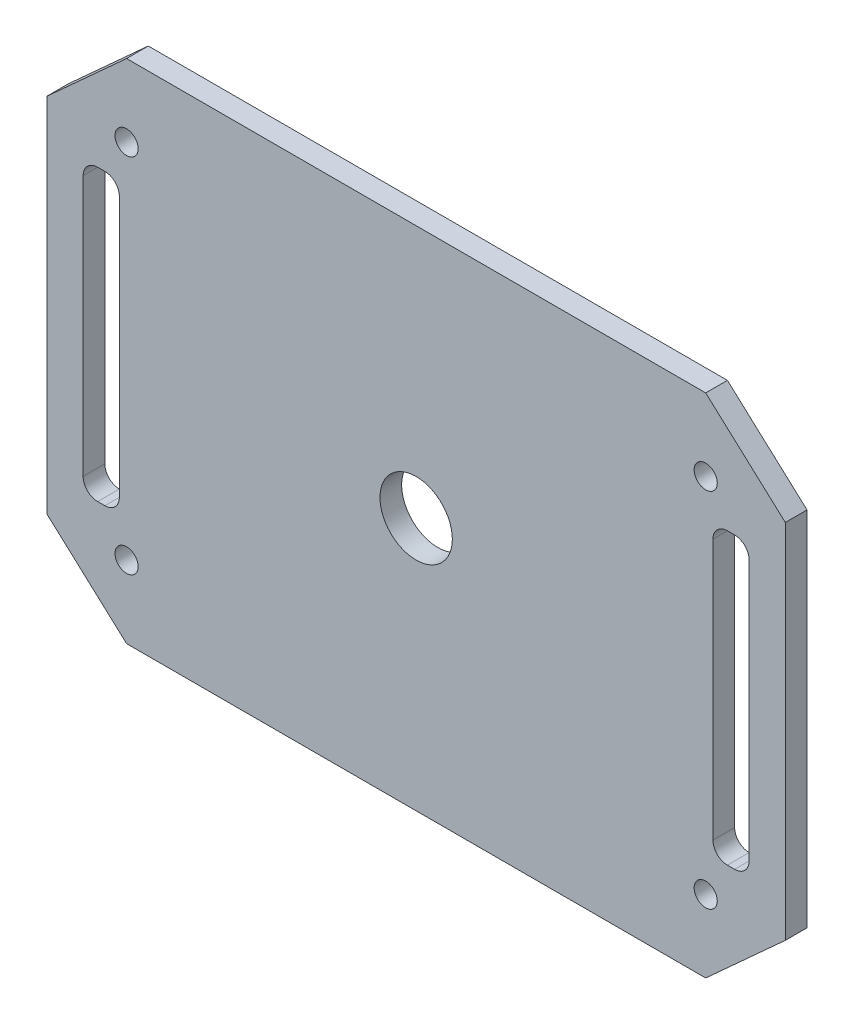
ISO-10303-21;
HEADER;
FILE_DESCRIPTION(('STEP AP214'),'2;1');
FILE_NAME('part.step','',(''),(''),'','','');
FILE_SCHEMA(('AUTOMOTIVE_DESIGN { 1 0 10303 214 1 1 1 1 }'));
ENDSEC;
DATA;
#1=APPLICATION_CONTEXT('core data for automotive mechanical design processes');
#2=APPLICATION_PROTOCOL_DEFINITION('international standard','automotive_design',2000,#1);
#3=PRODUCT_CONTEXT('',#1,'mechanical');
#4=PRODUCT('Part','Part','',(#3));
#5=PRODUCT_RELATED_PRODUCT_CATEGORY('part','',(#4));
#6=PRODUCT_DEFINITION_FORMATION('','',#4);
#7=PRODUCT_DEFINITION_CONTEXT('part definition',#1,'design');
#8=PRODUCT_DEFINITION('design','',#6,#7);
#9=PRODUCT_DEFINITION_SHAPE('','',#8);
#10=(LENGTH_UNIT() NAMED_UNIT(*) SI_UNIT(.MILLI.,.METRE.));
#11=(NAMED_UNIT(*) PLANE_ANGLE_UNIT() SI_UNIT($,.RADIAN.));
#12=(NAMED_UNIT(*) SI_UNIT($,.STERADIAN.) SOLID_ANGLE_UNIT());
#13=UNCERTAINTY_MEASURE_WITH_UNIT(LENGTH_MEASURE(1.E-05),#10,'distance_accuracy_value','');
#14=(GEOMETRIC_REPRESENTATION_CONTEXT(3) GLOBAL_UNCERTAINTY_ASSIGNED_CONTEXT((#13)) GLOBAL_UNIT_ASSIGNED_CONTEXT((#10,
#11,#12)) REPRESENTATION_CONTEXT('',''));
#15=CARTESIAN_POINT('',(0.,0.,0.));
#16=DIRECTION('',(0.,0.,1.));
#17=DIRECTION('',(1.,0.,0.));
#18=AXIS2_PLACEMENT_3D('',#15,#16,#17);
#19=CARTESIAN_POINT('',(0.,0.,3.));
#20=DIRECTION('',(0.,0.,1.));
#21=DIRECTION('',(1.,0.,0.));
#22=AXIS2_PLACEMENT_3D('',#19,#20,#21);
#23=PLANE('',#22);
#24=CARTESIAN_POINT('',(0.1460104534,-83.8449471917,3.));
#25=DIRECTION('',(0.,0.,1.));
#26=DIRECTION('',(1.,0.,0.));
#27=AXIS2_PLACEMENT_3D('',#24,#25,#26);
#28=CIRCLE('',#27,1.6);
#29=CARTESIAN_POINT('',(1.7460104534,-83.8449471917,3.));
#30=VERTEX_POINT('',#29);
#31=EDGE_CURVE('E662',#30,#30,#28,.T.);
#32=ORIENTED_EDGE('',*,*,#31,.F.);
#33=EDGE_LOOP('',(#32));
#34=FACE_BOUND('',#33,.T.);
#35=CARTESIAN_POINT('',(80.1460104534,-33.8449471917,3.));
#36=DIRECTION('',(0.,0.,1.));
#37=DIRECTION('',(1.,0.,0.));
#38=AXIS2_PLACEMENT_3D('',#35,#36,#37);
#39=CIRCLE('',#38,1.60000000000001);
#40=CARTESIAN_POINT('',(81.7460104534,-33.8449471917,3.));
#41=VERTEX_POINT('',#40);
#42=EDGE_CURVE('E674',#41,#41,#39,.T.);
#43=ORIENTED_EDGE('',*,*,#42,.F.);
#44=EDGE_LOOP('',(#43));
#45=FACE_BOUND('',#44,.T.);
#46=DIRECTION('',(0.,1.,0.));
#47=VECTOR('',#46,1.);
#48=CARTESIAN_POINT('',(-0.8539895466,-40.8449471917,3.));
#49=LINE('',#48,#47);
#50=CARTESIAN_POINT('',(-0.8539895466,-76.8449471917,3.));
#51=VERTEX_POINT('',#50);
#52=CARTESIAN_POINT('',(-0.853989546599999,-40.8449471917,3.));
#53=VERTEX_POINT('',#52);
#54=EDGE_CURVE('E202',#51,#53,#49,.T.);
#55=ORIENTED_EDGE('',*,*,#54,.F.);
#56=CARTESIAN_POINT('',(-2.8539895466,-76.8449471917,3.));
#57=DIRECTION('',(0.,0.,1.));
#58=DIRECTION('',(1.,0.,0.));
#59=AXIS2_PLACEMENT_3D('',#56,#57,#58);
#60=CIRCLE('',#59,2.);
#61=CARTESIAN_POINT('',(-2.8539895466,-78.8449471917,3.));
#62=VERTEX_POINT('',#61);
#63=EDGE_CURVE('E194',#62,#51,#60,.T.);
#64=ORIENTED_EDGE('',*,*,#63,.F.);
#65=DIRECTION('',(1.,0.,0.));
#66=VECTOR('',#65,1.);
#67=CARTESIAN_POINT('',(-3.8539895466,-78.8449471917,3.));
#68=LINE('',#67,#66);
#69=CARTESIAN_POINT('',(-3.8539895466,-78.8449471917,3.));
#70=VERTEX_POINT('',#69);
#71=EDGE_CURVE('E229',#70,#62,#68,.T.);
#72=ORIENTED_EDGE('',*,*,#71,.F.);
#73=CARTESIAN_POINT('',(-3.8539895466,-76.8449471917,3.));
#74=DIRECTION('',(0.,0.,1.));
#75=DIRECTION('',(1.,0.,0.));
#76=AXIS2_PLACEMENT_3D('',#73,#74,#75);
#77=CIRCLE('',#76,2.);
#78=CARTESIAN_POINT('',(-5.8539895466,-76.8449471917,3.));
#79=VERTEX_POINT('',#78);
#80=EDGE_CURVE('E227',#79,#70,#77,.T.);
#81=ORIENTED_EDGE('',*,*,#80,.F.);
#82=DIRECTION('',(0.,-1.,0.));
#83=VECTOR('',#82,1.);
#84=CARTESIAN_POINT('',(-5.8539895466,-40.8449471917,3.));
#85=LINE('',#84,#83);
#86=CARTESIAN_POINT('',(-5.8539895466,-40.8449471917,3.));
#87=VERTEX_POINT('',#86);
#88=EDGE_CURVE('E225',#87,#79,#85,.T.);
#89=ORIENTED_EDGE('',*,*,#88,.F.);
#90=CARTESIAN_POINT('',(-3.8539895466,-40.8449471917,3.));
#91=DIRECTION('',(0.,0.,1.));
#92=DIRECTION('',(1.,0.,0.));
#93=AXIS2_PLACEMENT_3D('',#90,#91,#92);
#94=CIRCLE('',#93,2.);
#95=CARTESIAN_POINT('',(-3.8539895466,-38.8449471917,3.));
#96=VERTEX_POINT('',#95);
#97=EDGE_CURVE('E223',#96,#87,#94,.T.);
#98=ORIENTED_EDGE('',*,*,#97,.F.);
#99=DIRECTION('',(-1.,0.,0.));
#100=VECTOR('',#99,1.);
#101=CARTESIAN_POINT('',(-3.8539895466,-38.8449471917,3.));
#102=LINE('',#101,#100);
#103=CARTESIAN_POINT('',(-2.8539895466,-38.8449471917,3.));
#104=VERTEX_POINT('',#103);
#105=EDGE_CURVE('E218',#104,#96,#102,.T.);
#106=ORIENTED_EDGE('',*,*,#105,.F.);
#107=CARTESIAN_POINT('',(-2.8539895466,-40.8449471917,3.));
#108=DIRECTION('',(0.,0.,1.));
#109=DIRECTION('',(1.,0.,0.));
#110=AXIS2_PLACEMENT_3D('',#107,#108,#109);
#111=CIRCLE('',#110,2.);
#112=EDGE_CURVE('E216',#53,#104,#111,.T.);
#113=ORIENTED_EDGE('',*,*,#112,.F.);
#114=EDGE_LOOP('',(#55,#64,#72,#81,#89,#98,#106,#113));
#115=FACE_BOUND('',#114,.T.);
#116=DIRECTION('',(-1.,0.,0.));
#117=VECTOR('',#116,1.);
#118=CARTESIAN_POINT('',(84.1460104534,-38.8449471917,3.));
#119=LINE('',#118,#117);
#120=CARTESIAN_POINT('',(84.1460104534,-38.8449471917,3.));
#121=VERTEX_POINT('',#120);
#122=CARTESIAN_POINT('',(83.1460104534,-38.8449471917,3.));
#123=VERTEX_POINT('',#122);
#124=EDGE_CURVE('E264',#121,#123,#119,.T.);
#125=ORIENTED_EDGE('',*,*,#124,.F.);
#126=CARTESIAN_POINT('',(84.1460104534,-40.8449471917,3.));
#127=DIRECTION('',(0.,0.,1.));
#128=DIRECTION('',(1.,0.,0.));
#129=AXIS2_PLACEMENT_3D('',#126,#127,#128);
#130=CIRCLE('',#129,2.);
#131=CARTESIAN_POINT('',(86.1460104534,-40.8449471917,3.));
#132=VERTEX_POINT('',#131);
#133=EDGE_CURVE('E262',#132,#121,#130,.T.);
#134=ORIENTED_EDGE('',*,*,#133,.F.);
#135=DIRECTION('',(0.,1.,0.));
#136=VECTOR('',#135,1.);
#137=CARTESIAN_POINT('',(86.1460104534,-40.8449471917,3.));
#138=LINE('',#137,#136);
#139=CARTESIAN_POINT('',(86.1460104534,-76.8449471917,3.));
#140=VERTEX_POINT('',#139);
#141=EDGE_CURVE('E278',#140,#132,#138,.T.);
#142=ORIENTED_EDGE('',*,*,#141,.F.);
#143=CARTESIAN_POINT('',(84.1460104534,-76.8449471917,3.));
#144=DIRECTION('',(0.,0.,1.));
#145=DIRECTION('',(1.,0.,0.));
#146=AXIS2_PLACEMENT_3D('',#143,#144,#145);
#147=CIRCLE('',#146,2.);
#148=CARTESIAN_POINT('',(84.1460104534,-78.8449471917,3.));
#149=VERTEX_POINT('',#148);
#150=EDGE_CURVE('E275',#149,#140,#147,.T.);
#151=ORIENTED_EDGE('',*,*,#150,.F.);
#152=DIRECTION('',(1.,0.,0.));
#153=VECTOR('',#152,1.);
#154=CARTESIAN_POINT('',(84.1460104534,-78.8449471917,3.));
#155=LINE('',#154,#153);
#156=CARTESIAN_POINT('',(83.1460104534,-78.8449471917,3.));
#157=VERTEX_POINT('',#156);
#158=EDGE_CURVE('E273',#157,#149,#155,.T.);
#159=ORIENTED_EDGE('',*,*,#158,.F.);
#160=CARTESIAN_POINT('',(83.1460104534,-76.8449471917,3.));
#161=DIRECTION('',(0.,0.,1.));
#162=DIRECTION('',(1.,0.,0.));
#163=AXIS2_PLACEMENT_3D('',#160,#161,#162);
#164=CIRCLE('',#163,1.99999999999999);
#165=CARTESIAN_POINT('',(81.1460104534,-76.8449471917,3.));
#166=VERTEX_POINT('',#165);
#167=EDGE_CURVE('E271',#166,#157,#164,.T.);
#168=ORIENTED_EDGE('',*,*,#167,.F.);
#169=DIRECTION('',(0.,-1.,0.));
#170=VECTOR('',#169,1.);
#171=CARTESIAN_POINT('',(81.1460104534,-40.8449471917,3.));
#172=LINE('',#171,#170);
#173=CARTESIAN_POINT('',(81.1460104534,-40.8449471917,3.));
#174=VERTEX_POINT('',#173);
#175=EDGE_CURVE('E269',#174,#166,#172,.T.);
#176=ORIENTED_EDGE('',*,*,#175,.F.);
#177=CARTESIAN_POINT('',(83.1460104534,-40.8449471917,3.));
#178=DIRECTION('',(0.,0.,1.));
#179=DIRECTION('',(1.,0.,0.));
#180=AXIS2_PLACEMENT_3D('',#177,#178,#179);
#181=CIRCLE('',#180,1.99999999999999);
#182=EDGE_CURVE('E267',#123,#174,#181,.T.);
#183=ORIENTED_EDGE('',*,*,#182,.F.);
#184=EDGE_LOOP('',(#125,#134,#142,#151,#159,#168,#176,#183));
#185=FACE_BOUND('',#184,.T.);
#186=DIRECTION('',(0.,-1.,0.));
#187=VECTOR('',#186,1.);
#188=CARTESIAN_POINT('',(-10.8539895466,-33.8449471917,3.));
#189=LINE('',#188,#187);
#190=CARTESIAN_POINT('',(-10.8539895466,-33.8449471917,3.));
#191=VERTEX_POINT('',#190);
#192=CARTESIAN_POINT('',(-10.8539895466,-83.8449471917,3.));
#193=VERTEX_POINT('',#192);
#194=EDGE_CURVE('E321',#191,#193,#189,.T.);
#195=ORIENTED_EDGE('',*,*,#194,.T.);
#196=DIRECTION('',(0.739940073395944,-0.672672793996312,0.));
#197=VECTOR('',#196,1.);
#198=CARTESIAN_POINT('',(-10.8539895466,-83.8449471917,3.));
#199=LINE('',#198,#197);
#200=CARTESIAN_POINT('',(0.1460104534,-93.8449471917,3.));
#201=VERTEX_POINT('',#200);
#202=EDGE_CURVE('E324',#193,#201,#199,.T.);
#203=ORIENTED_EDGE('',*,*,#202,.T.);
#204=DIRECTION('',(1.,0.,0.));
#205=VECTOR('',#204,1.);
#206=CARTESIAN_POINT('',(0.1460104534,-93.8449471917,3.));
#207=LINE('',#206,#205);
#208=CARTESIAN_POINT('',(80.1460104534,-93.8449471917,3.));
#209=VERTEX_POINT('',#208);
#210=EDGE_CURVE('E327',#201,#209,#207,.T.);
#211=ORIENTED_EDGE('',*,*,#210,.T.);
#212=DIRECTION('',(0.739940073395944,0.672672793996312,0.));
#213=VECTOR('',#212,1.);
#214=CARTESIAN_POINT('',(80.1460104534,-93.8449471917,3.));
#215=LINE('',#214,#213);
#216=CARTESIAN_POINT('',(91.1460104534,-83.8449471917,3.));
#217=VERTEX_POINT('',#216);
#218=EDGE_CURVE('E329',#209,#217,#215,.T.);
#219=ORIENTED_EDGE('',*,*,#218,.T.);
#220=DIRECTION('',(0.,1.,0.));
#221=VECTOR('',#220,1.);
#222=CARTESIAN_POINT('',(91.1460104534,-33.8449471917,3.));
#223=LINE('',#222,#221);
#224=CARTESIAN_POINT('',(91.1460104534,-33.8449471917,3.));
#225=VERTEX_POINT('',#224);
#226=EDGE_CURVE('E331',#217,#225,#223,.T.);
#227=ORIENTED_EDGE('',*,*,#226,.T.);
#228=DIRECTION('',(-0.739940073395943,0.672672793996313,0.));
#229=VECTOR('',#228,1.);
#230=CARTESIAN_POINT('',(80.1460104534,-23.8449471917,3.));
#231=LINE('',#230,#229);
#232=CARTESIAN_POINT('',(80.1460104534,-23.8449471917,3.));
#233=VERTEX_POINT('',#232);
#234=EDGE_CURVE('E333',#225,#233,#231,.T.);
#235=ORIENTED_EDGE('',*,*,#234,.T.);
#236=DIRECTION('',(-1.,0.,0.));
#237=VECTOR('',#236,1.);
#238=CARTESIAN_POINT('',(0.1460104534,-23.8449471917,3.));
#239=LINE('',#238,#237);
#240=CARTESIAN_POINT('',(0.1460104534,-23.8449471917,3.));
#241=VERTEX_POINT('',#240);
#242=EDGE_CURVE('E335',#233,#241,#239,.T.);
#243=ORIENTED_EDGE('',*,*,#242,.T.);
#244=DIRECTION('',(-0.739940073395944,-0.672672793996313,0.));
#245=VECTOR('',#244,1.);
#246=CARTESIAN_POINT('',(-10.8539895466,-33.8449471917,3.));
#247=LINE('',#246,#245);
#248=EDGE_CURVE('E337',#241,#191,#247,.T.);
#249=ORIENTED_EDGE('',*,*,#248,.T.);
#250=EDGE_LOOP('',(#195,#203,#211,#219,#227,#235,#243,#249));
#251=FACE_BOUND('',#250,.T.);
#252=CARTESIAN_POINT('',(0.1460104534,-33.8449471917,3.));
#253=DIRECTION('',(0.,0.,1.));
#254=DIRECTION('',(1.,0.,0.));
#255=AXIS2_PLACEMENT_3D('',#252,#253,#254);
#256=CIRCLE('',#255,1.6);
#257=CARTESIAN_POINT('',(1.7460104534,-33.8449471917,3.));
#258=VERTEX_POINT('',#257);
#259=EDGE_CURVE('E232',#258,#258,#256,.T.);
#260=ORIENTED_EDGE('',*,*,#259,.F.);
#261=EDGE_LOOP('',(#260));
#262=FACE_BOUND('',#261,.T.);
#263=CARTESIAN_POINT('',(80.1460104534,-83.8449471917,3.));
#264=DIRECTION('',(0.,0.,1.));
#265=DIRECTION('',(1.,0.,0.));
#266=AXIS2_PLACEMENT_3D('',#263,#264,#265);
#267=CIRCLE('',#266,1.60000000000001);
#268=CARTESIAN_POINT('',(81.7460104534,-83.8449471917,3.));
#269=VERTEX_POINT('',#268);
#270=EDGE_CURVE('E668',#269,#269,#267,.T.);
#271=ORIENTED_EDGE('',*,*,#270,.F.);
#272=EDGE_LOOP('',(#271));
#273=FACE_BOUND('',#272,.T.);
#274=CARTESIAN_POINT('',(40.1460104534,-58.8449471917,3.));
#275=DIRECTION('',(0.,0.,1.));
#276=DIRECTION('',(1.,0.,0.));
#277=AXIS2_PLACEMENT_3D('',#274,#275,#276);
#278=CIRCLE('',#277,5.);
#279=CARTESIAN_POINT('',(45.1460104534,-58.8449471917,3.));
#280=VERTEX_POINT('',#279);
#281=EDGE_CURVE('E653',#280,#280,#278,.T.);
#282=ORIENTED_EDGE('',*,*,#281,.F.);
#283=EDGE_LOOP('',(#282));
#284=FACE_BOUND('',#283,.T.);
#285=ADVANCED_FACE('F33',(#34,#45,#115,#185,#251,#262,#273,#284),#23,.T.);
#286=CARTESIAN_POINT('',(0.,0.,0.));
#287=DIRECTION('',(0.,0.,1.));
#288=DIRECTION('',(1.,0.,0.));
#289=AXIS2_PLACEMENT_3D('',#286,#287,#288);
#290=PLANE('',#289);
#291=CARTESIAN_POINT('',(84.1460104534,-40.8449471917,0.));
#292=DIRECTION('',(0.,0.,1.));
#293=DIRECTION('',(1.,0.,0.));
#294=AXIS2_PLACEMENT_3D('',#291,#292,#293);
#295=CIRCLE('',#294,2.);
#296=CARTESIAN_POINT('',(86.1460104534,-40.8449471917,0.));
#297=VERTEX_POINT('',#296);
#298=CARTESIAN_POINT('',(84.1460104534,-38.8449471917,0.));
#299=VERTEX_POINT('',#298);
#300=EDGE_CURVE('E210',#297,#299,#295,.T.);
#301=ORIENTED_EDGE('',*,*,#300,.T.);
#302=DIRECTION('',(-1.,0.,0.));
#303=VECTOR('',#302,1.);
#304=CARTESIAN_POINT('',(84.1460104534,-38.8449471917,0.));
#305=LINE('',#304,#303);
#306=CARTESIAN_POINT('',(83.1460104534,-38.8449471917,0.));
#307=VERTEX_POINT('',#306);
#308=EDGE_CURVE('E283',#299,#307,#305,.T.);
#309=ORIENTED_EDGE('',*,*,#308,.T.);
#310=CARTESIAN_POINT('',(83.1460104534,-40.8449471917,0.));
#311=DIRECTION('',(0.,0.,1.));
#312=DIRECTION('',(1.,0.,0.));
#313=AXIS2_PLACEMENT_3D('',#310,#311,#312);
#314=CIRCLE('',#313,1.99999999999999);
#315=CARTESIAN_POINT('',(81.1460104534,-40.8449471917,0.));
#316=VERTEX_POINT('',#315);
#317=EDGE_CURVE('E286',#307,#316,#314,.T.);
#318=ORIENTED_EDGE('',*,*,#317,.T.);
#319=DIRECTION('',(0.,-1.,0.));
#320=VECTOR('',#319,1.);
#321=CARTESIAN_POINT('',(81.1460104534,-40.8449471917,0.));
#322=LINE('',#321,#320);
#323=CARTESIAN_POINT('',(81.1460104534,-76.8449471917,0.));
#324=VERTEX_POINT('',#323);
#325=EDGE_CURVE('E289',#316,#324,#322,.T.);
#326=ORIENTED_EDGE('',*,*,#325,.T.);
#327=CARTESIAN_POINT('',(83.1460104534,-76.8449471917,0.));
#328=DIRECTION('',(0.,0.,1.));
#329=DIRECTION('',(1.,0.,0.));
#330=AXIS2_PLACEMENT_3D('',#327,#328,#329);
#331=CIRCLE('',#330,1.99999999999999);
#332=CARTESIAN_POINT('',(83.1460104534,-78.8449471917,0.));
#333=VERTEX_POINT('',#332);
#334=EDGE_CURVE('E292',#324,#333,#331,.T.);
#335=ORIENTED_EDGE('',*,*,#334,.T.);
#336=DIRECTION('',(1.,0.,0.));
#337=VECTOR('',#336,1.);
#338=CARTESIAN_POINT('',(84.1460104534,-78.8449471917,0.));
#339=LINE('',#338,#337);
#340=CARTESIAN_POINT('',(84.1460104534,-78.8449471917,0.));
#341=VERTEX_POINT('',#340);
#342=EDGE_CURVE('E295',#333,#341,#339,.T.);
#343=ORIENTED_EDGE('',*,*,#342,.T.);
#344=CARTESIAN_POINT('',(84.1460104534,-76.8449471917,0.));
#345=DIRECTION('',(0.,0.,1.));
#346=DIRECTION('',(1.,0.,0.));
#347=AXIS2_PLACEMENT_3D('',#344,#345,#346);
#348=CIRCLE('',#347,2.);
#349=CARTESIAN_POINT('',(86.1460104534,-76.8449471917,0.));
#350=VERTEX_POINT('',#349);
#351=EDGE_CURVE('E298',#341,#350,#348,.T.);
#352=ORIENTED_EDGE('',*,*,#351,.T.);
#353=DIRECTION('',(0.,1.,0.));
#354=VECTOR('',#353,1.);
#355=CARTESIAN_POINT('',(86.1460104534,-40.8449471917,0.));
#356=LINE('',#355,#354);
#357=EDGE_CURVE('E265',#350,#297,#356,.T.);
#358=ORIENTED_EDGE('',*,*,#357,.T.);
#359=EDGE_LOOP('',(#301,#309,#318,#326,#335,#343,#352,#358));
#360=FACE_BOUND('',#359,.T.);
#361=DIRECTION('',(0.,-1.,0.));
#362=VECTOR('',#361,1.);
#363=CARTESIAN_POINT('',(-10.8539895466,-33.8449471917,0.));
#364=LINE('',#363,#362);
#365=CARTESIAN_POINT('',(-10.8539895466,-33.8449471917,0.));
#366=VERTEX_POINT('',#365);
#367=CARTESIAN_POINT('',(-10.8539895466,-83.8449471917,0.));
#368=VERTEX_POINT('',#367);
#369=EDGE_CURVE('E320',#366,#368,#364,.T.);
#370=ORIENTED_EDGE('',*,*,#369,.F.);
#371=DIRECTION('',(-0.739940073395944,-0.672672793996313,0.));
#372=VECTOR('',#371,1.);
#373=CARTESIAN_POINT('',(-10.8539895466,-33.8449471917,0.));
#374=LINE('',#373,#372);
#375=CARTESIAN_POINT('',(0.1460104534,-23.8449471917,0.));
#376=VERTEX_POINT('',#375);
#377=EDGE_CURVE('E325',#376,#366,#374,.T.);
#378=ORIENTED_EDGE('',*,*,#377,.F.);
#379=DIRECTION('',(-1.,0.,0.));
#380=VECTOR('',#379,1.);
#381=CARTESIAN_POINT('',(0.1460104534,-23.8449471917,0.));
#382=LINE('',#381,#380);
#383=CARTESIAN_POINT('',(80.1460104534,-23.8449471917,0.));
#384=VERTEX_POINT('',#383);
#385=EDGE_CURVE('E352',#384,#376,#382,.T.);
#386=ORIENTED_EDGE('',*,*,#385,.F.);
#387=DIRECTION('',(-0.739940073395943,0.672672793996313,0.));
#388=VECTOR('',#387,1.);
#389=CARTESIAN_POINT('',(80.1460104534,-23.8449471917,0.));
#390=LINE('',#389,#388);
#391=CARTESIAN_POINT('',(91.1460104534,-33.8449471917,0.));
#392=VERTEX_POINT('',#391);
#393=EDGE_CURVE('E350',#392,#384,#390,.T.);
#394=ORIENTED_EDGE('',*,*,#393,.F.);
#395=DIRECTION('',(0.,1.,0.));
#396=VECTOR('',#395,1.);
#397=CARTESIAN_POINT('',(91.1460104534,-33.8449471917,0.));
#398=LINE('',#397,#396);
#399=CARTESIAN_POINT('',(91.1460104534,-83.8449471917,0.));
#400=VERTEX_POINT('',#399);
#401=EDGE_CURVE('E348',#400,#392,#398,.T.);
#402=ORIENTED_EDGE('',*,*,#401,.F.);
#403=DIRECTION('',(0.739940073395944,0.672672793996312,0.));
#404=VECTOR('',#403,1.);
#405=CARTESIAN_POINT('',(80.1460104534,-93.8449471917,0.));
#406=LINE('',#405,#404);
#407=CARTESIAN_POINT('',(80.1460104534,-93.8449471917,0.));
#408=VERTEX_POINT('',#407);
#409=EDGE_CURVE('E346',#408,#400,#406,.T.);
#410=ORIENTED_EDGE('',*,*,#409,.F.);
#411=DIRECTION('',(1.,0.,0.));
#412=VECTOR('',#411,1.);
#413=CARTESIAN_POINT('',(0.1460104534,-93.8449471917,0.));
#414=LINE('',#413,#412);
#415=CARTESIAN_POINT('',(0.1460104534,-93.8449471917,0.));
#416=VERTEX_POINT('',#415);
#417=EDGE_CURVE('E344',#416,#408,#414,.T.);
#418=ORIENTED_EDGE('',*,*,#417,.F.);
#419=DIRECTION('',(0.739940073395944,-0.672672793996312,0.));
#420=VECTOR('',#419,1.);
#421=CARTESIAN_POINT('',(-10.8539895466,-83.8449471917,0.));
#422=LINE('',#421,#420);
#423=EDGE_CURVE('E342',#368,#416,#422,.T.);
#424=ORIENTED_EDGE('',*,*,#423,.F.);
#425=EDGE_LOOP('',(#370,#378,#386,#394,#402,#410,#418,#424));
#426=FACE_BOUND('',#425,.T.);
#427=CARTESIAN_POINT('',(-2.8539895466,-76.8449471917,0.));
#428=DIRECTION('',(0.,0.,1.));
#429=DIRECTION('',(1.,0.,0.));
#430=AXIS2_PLACEMENT_3D('',#427,#428,#429);
#431=CIRCLE('',#430,2.);
#432=CARTESIAN_POINT('',(-2.8539895466,-78.8449471917,0.));
#433=VERTEX_POINT('',#432);
#434=CARTESIAN_POINT('',(-0.8539895466,-76.8449471917,0.));
#435=VERTEX_POINT('',#434);
#436=EDGE_CURVE('E56',#433,#435,#431,.T.);
#437=ORIENTED_EDGE('',*,*,#436,.T.);
#438=DIRECTION('',(0.,1.,0.));
#439=VECTOR('',#438,1.);
#440=CARTESIAN_POINT('',(-0.8539895466,-40.8449471917,0.));
#441=LINE('',#440,#439);
#442=CARTESIAN_POINT('',(-0.853989546599999,-40.8449471917,0.));
#443=VERTEX_POINT('',#442);
#444=EDGE_CURVE('E209',#435,#443,#441,.T.);
#445=ORIENTED_EDGE('',*,*,#444,.T.);
#446=CARTESIAN_POINT('',(-2.8539895466,-40.8449471917,0.));
#447=DIRECTION('',(0.,0.,1.));
#448=DIRECTION('',(1.,0.,0.));
#449=AXIS2_PLACEMENT_3D('',#446,#447,#448);
#450=CIRCLE('',#449,2.);
#451=CARTESIAN_POINT('',(-2.8539895466,-38.8449471917,0.));
#452=VERTEX_POINT('',#451);
#453=EDGE_CURVE('E234',#443,#452,#450,.T.);
#454=ORIENTED_EDGE('',*,*,#453,.T.);
#455=DIRECTION('',(-1.,0.,0.));
#456=VECTOR('',#455,1.);
#457=CARTESIAN_POINT('',(-3.8539895466,-38.8449471917,0.));
#458=LINE('',#457,#456);
#459=CARTESIAN_POINT('',(-3.8539895466,-38.8449471917,0.));
#460=VERTEX_POINT('',#459);
#461=EDGE_CURVE('E237',#452,#460,#458,.T.);
#462=ORIENTED_EDGE('',*,*,#461,.T.);
#463=CARTESIAN_POINT('',(-3.8539895466,-40.8449471917,0.));
#464=DIRECTION('',(0.,0.,1.));
#465=DIRECTION('',(1.,0.,0.));
#466=AXIS2_PLACEMENT_3D('',#463,#464,#465);
#467=CIRCLE('',#466,2.);
#468=CARTESIAN_POINT('',(-5.8539895466,-40.8449471917,0.));
#469=VERTEX_POINT('',#468);
#470=EDGE_CURVE('E240',#460,#469,#467,.T.);
#471=ORIENTED_EDGE('',*,*,#470,.T.);
#472=DIRECTION('',(0.,-1.,0.));
#473=VECTOR('',#472,1.);
#474=CARTESIAN_POINT('',(-5.8539895466,-40.8449471917,0.));
#475=LINE('',#474,#473);
#476=CARTESIAN_POINT('',(-5.8539895466,-76.8449471917,0.));
#477=VERTEX_POINT('',#476);
#478=EDGE_CURVE('E243',#469,#477,#475,.T.);
#479=ORIENTED_EDGE('',*,*,#478,.T.);
#480=CARTESIAN_POINT('',(-3.8539895466,-76.8449471917,0.));
#481=DIRECTION('',(0.,0.,1.));
#482=DIRECTION('',(1.,0.,0.));
#483=AXIS2_PLACEMENT_3D('',#480,#481,#482);
#484=CIRCLE('',#483,2.);
#485=CARTESIAN_POINT('',(-3.8539895466,-78.8449471917,0.));
#486=VERTEX_POINT('',#485);
#487=EDGE_CURVE('E246',#477,#486,#484,.T.);
#488=ORIENTED_EDGE('',*,*,#487,.T.);
#489=DIRECTION('',(1.,0.,0.));
#490=VECTOR('',#489,1.);
#491=CARTESIAN_POINT('',(-3.8539895466,-78.8449471917,0.));
#492=LINE('',#491,#490);
#493=EDGE_CURVE('E203',#486,#433,#492,.T.);
#494=ORIENTED_EDGE('',*,*,#493,.T.);
#495=EDGE_LOOP('',(#437,#445,#454,#462,#471,#479,#488,#494));
#496=FACE_BOUND('',#495,.T.);
#497=CARTESIAN_POINT('',(0.1460104534,-33.8449471917,0.));
#498=DIRECTION('',(0.,0.,1.));
#499=DIRECTION('',(1.,0.,0.));
#500=AXIS2_PLACEMENT_3D('',#497,#498,#499);
#501=CIRCLE('',#500,1.6);
#502=CARTESIAN_POINT('',(1.7460104534,-33.8449471917,0.));
#503=VERTEX_POINT('',#502);
#504=EDGE_CURVE('E677',#503,#503,#501,.T.);
#505=ORIENTED_EDGE('',*,*,#504,.T.);
#506=EDGE_LOOP('',(#505));
#507=FACE_BOUND('',#506,.T.);
#508=CARTESIAN_POINT('',(80.1460104534,-33.8449471917,0.));
#509=DIRECTION('',(0.,0.,1.));
#510=DIRECTION('',(1.,0.,0.));
#511=AXIS2_PLACEMENT_3D('',#508,#509,#510);
#512=CIRCLE('',#511,1.60000000000001);
#513=CARTESIAN_POINT('',(81.7460104534,-33.8449471917,0.));
#514=VERTEX_POINT('',#513);
#515=EDGE_CURVE('E671',#514,#514,#512,.T.);
#516=ORIENTED_EDGE('',*,*,#515,.T.);
#517=EDGE_LOOP('',(#516));
#518=FACE_BOUND('',#517,.T.);
#519=CARTESIAN_POINT('',(80.1460104534,-83.8449471917,0.));
#520=DIRECTION('',(0.,0.,1.));
#521=DIRECTION('',(1.,0.,0.));
#522=AXIS2_PLACEMENT_3D('',#519,#520,#521);
#523=CIRCLE('',#522,1.60000000000001);
#524=CARTESIAN_POINT('',(81.7460104534,-83.8449471917,0.));
#525=VERTEX_POINT('',#524);
#526=EDGE_CURVE('E665',#525,#525,#523,.T.);
#527=ORIENTED_EDGE('',*,*,#526,.T.);
#528=EDGE_LOOP('',(#527));
#529=FACE_BOUND('',#528,.T.);
#530=CARTESIAN_POINT('',(0.1460104534,-83.8449471917,0.));
#531=DIRECTION('',(0.,0.,1.));
#532=DIRECTION('',(1.,0.,0.));
#533=AXIS2_PLACEMENT_3D('',#530,#531,#532);
#534=CIRCLE('',#533,1.6);
#535=CARTESIAN_POINT('',(1.7460104534,-83.8449471917,0.));
#536=VERTEX_POINT('',#535);
#537=EDGE_CURVE('E659',#536,#536,#534,.T.);
#538=ORIENTED_EDGE('',*,*,#537,.T.);
#539=EDGE_LOOP('',(#538));
#540=FACE_BOUND('',#539,.T.);
#541=CARTESIAN_POINT('',(40.1460104534,-58.8449471917,0.));
#542=DIRECTION('',(0.,0.,1.));
#543=DIRECTION('',(1.,0.,0.));
#544=AXIS2_PLACEMENT_3D('',#541,#542,#543);
#545=CIRCLE('',#544,5.);
#546=CARTESIAN_POINT('',(45.1460104534,-58.8449471917,0.));
#547=VERTEX_POINT('',#546);
#548=EDGE_CURVE('E656',#547,#547,#545,.T.);
#549=ORIENTED_EDGE('',*,*,#548,.T.);
#550=EDGE_LOOP('',(#549));
#551=FACE_BOUND('',#550,.T.);
#552=ADVANCED_FACE('F382',(#360,#426,#496,#507,#518,#529,#540,#551),#290,.F.);
#553=CARTESIAN_POINT('',(-10.8539895466,-33.8449471917,3.));
#554=DIRECTION('',(1.,0.,0.));
#555=DIRECTION('',(0.,0.,-1.));
#556=AXIS2_PLACEMENT_3D('',#553,#554,#555);
#557=PLANE('',#556);
#558=ORIENTED_EDGE('',*,*,#369,.T.);
#559=DIRECTION('',(0.,0.,-1.));
#560=VECTOR('',#559,1.);
#561=CARTESIAN_POINT('',(-10.8539895466,-83.8449471917,3.));
#562=LINE('',#561,#560);
#563=EDGE_CURVE('E11',#193,#368,#562,.T.);
#564=ORIENTED_EDGE('',*,*,#563,.F.);
#565=ORIENTED_EDGE('',*,*,#194,.F.);
#566=DIRECTION('',(0.,0.,-1.));
#567=VECTOR('',#566,1.);
#568=CARTESIAN_POINT('',(-10.8539895466,-33.8449471917,3.));
#569=LINE('',#568,#567);
#570=EDGE_CURVE('E339',#191,#366,#569,.T.);
#571=ORIENTED_EDGE('',*,*,#570,.T.);
#572=EDGE_LOOP('',(#558,#564,#565,#571));
#573=FACE_BOUND('',#572,.T.);
#574=ADVANCED_FACE('F35',(#573),#557,.F.);
#575=CARTESIAN_POINT('',(-10.8539895466,-83.8449471917,3.));
#576=DIRECTION('',(0.672672793996312,0.739940073395944,0.));
#577=DIRECTION('',(-0.739940073395944,0.672672793996312,0.));
#578=AXIS2_PLACEMENT_3D('',#575,#576,#577);
#579=PLANE('',#578);
#580=ORIENTED_EDGE('',*,*,#423,.T.);
#581=DIRECTION('',(0.,0.,-1.));
#582=VECTOR('',#581,1.);
#583=CARTESIAN_POINT('',(0.1460104534,-93.8449471917,3.));
#584=LINE('',#583,#582);
#585=EDGE_CURVE('E41',#201,#416,#584,.T.);
#586=ORIENTED_EDGE('',*,*,#585,.F.);
#587=ORIENTED_EDGE('',*,*,#202,.F.);
#588=ORIENTED_EDGE('',*,*,#563,.T.);
#589=EDGE_LOOP('',(#580,#586,#587,#588));
#590=FACE_BOUND('',#589,.T.);
#591=ADVANCED_FACE('F400',(#590),#579,.F.);
#592=CARTESIAN_POINT('',(0.1460104534,-93.8449471917,3.));
#593=DIRECTION('',(0.,1.,0.));
#594=DIRECTION('',(0.,0.,1.));
#595=AXIS2_PLACEMENT_3D('',#592,#593,#594);
#596=PLANE('',#595);
#597=ORIENTED_EDGE('',*,*,#417,.T.);
#598=DIRECTION('',(0.,0.,-1.));
#599=VECTOR('',#598,1.);
#600=CARTESIAN_POINT('',(80.1460104534,-93.8449471917,3.));
#601=LINE('',#600,#599);
#602=EDGE_CURVE('E369',#209,#408,#601,.T.);
#603=ORIENTED_EDGE('',*,*,#602,.F.);
#604=ORIENTED_EDGE('',*,*,#210,.F.);
#605=ORIENTED_EDGE('',*,*,#585,.T.);
#606=EDGE_LOOP('',(#597,#603,#604,#605));
#607=FACE_BOUND('',#606,.T.);
#608=ADVANCED_FACE('F376',(#607),#596,.F.);
#609=CARTESIAN_POINT('',(80.1460104534,-93.8449471917,3.));
#610=DIRECTION('',(-0.672672793996312,0.739940073395944,0.));
#611=DIRECTION('',(-0.739940073395944,-0.672672793996312,0.));
#612=AXIS2_PLACEMENT_3D('',#609,#610,#611);
#613=PLANE('',#612);
#614=ORIENTED_EDGE('',*,*,#409,.T.);
#615=DIRECTION('',(0.,0.,-1.));
#616=VECTOR('',#615,1.);
#617=CARTESIAN_POINT('',(91.1460104534,-83.8449471917,3.));
#618=LINE('',#617,#616);
#619=EDGE_CURVE('E366',#217,#400,#618,.T.);
#620=ORIENTED_EDGE('',*,*,#619,.F.);
#621=ORIENTED_EDGE('',*,*,#218,.F.);
#622=ORIENTED_EDGE('',*,*,#602,.T.);
#623=EDGE_LOOP('',(#614,#620,#621,#622));
#624=FACE_BOUND('',#623,.T.);
#625=ADVANCED_FACE('F388',(#624),#613,.F.);
#626=CARTESIAN_POINT('',(91.1460104534,-33.8449471917,3.));
#627=DIRECTION('',(-1.,0.,0.));
#628=DIRECTION('',(0.,0.,1.));
#629=AXIS2_PLACEMENT_3D('',#626,#627,#628);
#630=PLANE('',#629);
#631=ORIENTED_EDGE('',*,*,#401,.T.);
#632=DIRECTION('',(0.,0.,-1.));
#633=VECTOR('',#632,1.);
#634=CARTESIAN_POINT('',(91.1460104534,-33.8449471917,3.));
#635=LINE('',#634,#633);
#636=EDGE_CURVE('E363',#225,#392,#635,.T.);
#637=ORIENTED_EDGE('',*,*,#636,.F.);
#638=ORIENTED_EDGE('',*,*,#226,.F.);
#639=ORIENTED_EDGE('',*,*,#619,.T.);
#640=EDGE_LOOP('',(#631,#637,#638,#639));
#641=FACE_BOUND('',#640,.T.);
#642=ADVANCED_FACE('F392',(#641),#630,.F.);
#643=CARTESIAN_POINT('',(80.1460104534,-23.8449471917,3.));
#644=DIRECTION('',(-0.672672793996313,-0.739940073395944,0.));
#645=DIRECTION('',(0.739940073395944,-0.672672793996313,0.));
#646=AXIS2_PLACEMENT_3D('',#643,#644,#645);
#647=PLANE('',#646);
#648=ORIENTED_EDGE('',*,*,#393,.T.);
#649=DIRECTION('',(0.,0.,-1.));
#650=VECTOR('',#649,1.);
#651=CARTESIAN_POINT('',(80.1460104534,-23.8449471917,3.));
#652=LINE('',#651,#650);
#653=EDGE_CURVE('E360',#233,#384,#652,.T.);
#654=ORIENTED_EDGE('',*,*,#653,.F.);
#655=ORIENTED_EDGE('',*,*,#234,.F.);
#656=ORIENTED_EDGE('',*,*,#636,.T.);
#657=EDGE_LOOP('',(#648,#654,#655,#656));
#658=FACE_BOUND('',#657,.T.);
#659=ADVANCED_FACE('F413',(#658),#647,.F.);
#660=CARTESIAN_POINT('',(0.1460104534,-23.8449471917,3.));
#661=DIRECTION('',(0.,-1.,0.));
#662=DIRECTION('',(0.,0.,-1.));
#663=AXIS2_PLACEMENT_3D('',#660,#661,#662);
#664=PLANE('',#663);
#665=ORIENTED_EDGE('',*,*,#385,.T.);
#666=DIRECTION('',(0.,0.,-1.));
#667=VECTOR('',#666,1.);
#668=CARTESIAN_POINT('',(0.1460104534,-23.8449471917,3.));
#669=LINE('',#668,#667);
#670=EDGE_CURVE('E357',#241,#376,#669,.T.);
#671=ORIENTED_EDGE('',*,*,#670,.F.);
#672=ORIENTED_EDGE('',*,*,#242,.F.);
#673=ORIENTED_EDGE('',*,*,#653,.T.);
#674=EDGE_LOOP('',(#665,#671,#672,#673));
#675=FACE_BOUND('',#674,.T.);
#676=ADVANCED_FACE('F411',(#675),#664,.F.);
#677=CARTESIAN_POINT('',(-10.8539895466,-33.8449471917,3.));
#678=DIRECTION('',(0.672672793996313,-0.739940073395944,0.));
#679=DIRECTION('',(0.739940073395944,0.672672793996313,0.));
#680=AXIS2_PLACEMENT_3D('',#677,#678,#679);
#681=PLANE('',#680);
#682=ORIENTED_EDGE('',*,*,#377,.T.);
#683=ORIENTED_EDGE('',*,*,#570,.F.);
#684=ORIENTED_EDGE('',*,*,#248,.F.);
#685=ORIENTED_EDGE('',*,*,#670,.T.);
#686=EDGE_LOOP('',(#682,#683,#684,#685));
#687=FACE_BOUND('',#686,.T.);
#688=ADVANCED_FACE('F406',(#687),#681,.F.);
#689=CARTESIAN_POINT('',(84.1460104534,-40.8449471917,3.));
#690=DIRECTION('',(0.,0.,-1.));
#691=DIRECTION('',(-1.,0.,0.));
#692=AXIS2_PLACEMENT_3D('',#689,#690,#691);
#693=CYLINDRICAL_SURFACE('',#692,2.);
#694=ORIENTED_EDGE('',*,*,#300,.F.);
#695=DIRECTION('',(0.,0.,-1.));
#696=VECTOR('',#695,1.);
#697=CARTESIAN_POINT('',(86.1460104534,-40.8449471917,3.));
#698=LINE('',#697,#696);
#699=EDGE_CURVE('E280',#132,#297,#698,.T.);
#700=ORIENTED_EDGE('',*,*,#699,.F.);
#701=ORIENTED_EDGE('',*,*,#133,.T.);
#702=DIRECTION('',(0.,0.,-1.));
#703=VECTOR('',#702,1.);
#704=CARTESIAN_POINT('',(84.1460104534,-38.8449471917,3.));
#705=LINE('',#704,#703);
#706=EDGE_CURVE('E317',#121,#299,#705,.T.);
#707=ORIENTED_EDGE('',*,*,#706,.T.);
#708=EDGE_LOOP('',(#694,#700,#701,#707));
#709=FACE_BOUND('',#708,.T.);
#710=ADVANCED_FACE('F433',(#709),#693,.F.);
#711=CARTESIAN_POINT('',(84.1460104534,-38.8449471917,3.));
#712=DIRECTION('',(0.,-1.,0.));
#713=DIRECTION('',(0.,0.,-1.));
#714=AXIS2_PLACEMENT_3D('',#711,#712,#713);
#715=PLANE('',#714);
#716=ORIENTED_EDGE('',*,*,#308,.F.);
#717=ORIENTED_EDGE('',*,*,#706,.F.);
#718=ORIENTED_EDGE('',*,*,#124,.T.);
#719=DIRECTION('',(0.,0.,-1.));
#720=VECTOR('',#719,1.);
#721=CARTESIAN_POINT('',(83.1460104534,-38.8449471917,3.));
#722=LINE('',#721,#720);
#723=EDGE_CURVE('E315',#123,#307,#722,.T.);
#724=ORIENTED_EDGE('',*,*,#723,.T.);
#725=EDGE_LOOP('',(#716,#717,#718,#724));
#726=FACE_BOUND('',#725,.T.);
#727=ADVANCED_FACE('F440',(#726),#715,.T.);
#728=CARTESIAN_POINT('',(83.1460104534,-40.8449471917,3.));
#729=DIRECTION('',(0.,0.,-1.));
#730=DIRECTION('',(-1.,0.,0.));
#731=AXIS2_PLACEMENT_3D('',#728,#729,#730);
#732=CYLINDRICAL_SURFACE('',#731,1.99999999999999);
#733=ORIENTED_EDGE('',*,*,#317,.F.);
#734=ORIENTED_EDGE('',*,*,#723,.F.);
#735=ORIENTED_EDGE('',*,*,#182,.T.);
#736=DIRECTION('',(0.,0.,-1.));
#737=VECTOR('',#736,1.);
#738=CARTESIAN_POINT('',(81.1460104534,-40.8449471917,3.));
#739=LINE('',#738,#737);
#740=EDGE_CURVE('E313',#174,#316,#739,.T.);
#741=ORIENTED_EDGE('',*,*,#740,.T.);
#742=EDGE_LOOP('',(#733,#734,#735,#741));
#743=FACE_BOUND('',#742,.T.);
#744=ADVANCED_FACE('F445',(#743),#732,.F.);
#745=CARTESIAN_POINT('',(81.1460104534,-40.8449471917,3.));
#746=DIRECTION('',(1.,0.,0.));
#747=DIRECTION('',(0.,0.,-1.));
#748=AXIS2_PLACEMENT_3D('',#745,#746,#747);
#749=PLANE('',#748);
#750=ORIENTED_EDGE('',*,*,#325,.F.);
#751=ORIENTED_EDGE('',*,*,#740,.F.);
#752=ORIENTED_EDGE('',*,*,#175,.T.);
#753=DIRECTION('',(0.,0.,-1.));
#754=VECTOR('',#753,1.);
#755=CARTESIAN_POINT('',(81.1460104534,-76.8449471917,3.));
#756=LINE('',#755,#754);
#757=EDGE_CURVE('E311',#166,#324,#756,.T.);
#758=ORIENTED_EDGE('',*,*,#757,.T.);
#759=EDGE_LOOP('',(#750,#751,#752,#758));
#760=FACE_BOUND('',#759,.T.);
#761=ADVANCED_FACE('F470',(#760),#749,.T.);
#762=CARTESIAN_POINT('',(83.1460104534,-76.8449471917,3.));
#763=DIRECTION('',(0.,0.,-1.));
#764=DIRECTION('',(-1.,0.,0.));
#765=AXIS2_PLACEMENT_3D('',#762,#763,#764);
#766=CYLINDRICAL_SURFACE('',#765,1.99999999999999);
#767=ORIENTED_EDGE('',*,*,#334,.F.);
#768=ORIENTED_EDGE('',*,*,#757,.F.);
#769=ORIENTED_EDGE('',*,*,#167,.T.);
#770=DIRECTION('',(0.,0.,-1.));
#771=VECTOR('',#770,1.);
#772=CARTESIAN_POINT('',(83.1460104534,-78.8449471917,3.));
#773=LINE('',#772,#771);
#774=EDGE_CURVE('E309',#157,#333,#773,.T.);
#775=ORIENTED_EDGE('',*,*,#774,.T.);
#776=EDGE_LOOP('',(#767,#768,#769,#775));
#777=FACE_BOUND('',#776,.T.);
#778=ADVANCED_FACE('F475',(#777),#766,.F.);
#779=CARTESIAN_POINT('',(84.1460104534,-78.8449471917,3.));
#780=DIRECTION('',(0.,1.,0.));
#781=DIRECTION('',(0.,0.,1.));
#782=AXIS2_PLACEMENT_3D('',#779,#780,#781);
#783=PLANE('',#782);
#784=ORIENTED_EDGE('',*,*,#342,.F.);
#785=ORIENTED_EDGE('',*,*,#774,.F.);
#786=ORIENTED_EDGE('',*,*,#158,.T.);
#787=DIRECTION('',(0.,0.,-1.));
#788=VECTOR('',#787,1.);
#789=CARTESIAN_POINT('',(84.1460104534,-78.8449471917,3.));
#790=LINE('',#789,#788);
#791=EDGE_CURVE('E307',#149,#341,#790,.T.);
#792=ORIENTED_EDGE('',*,*,#791,.T.);
#793=EDGE_LOOP('',(#784,#785,#786,#792));
#794=FACE_BOUND('',#793,.T.);
#795=ADVANCED_FACE('F478',(#794),#783,.T.);
#796=CARTESIAN_POINT('',(84.1460104534,-76.8449471917,3.));
#797=DIRECTION('',(0.,0.,-1.));
#798=DIRECTION('',(-1.,0.,0.));
#799=AXIS2_PLACEMENT_3D('',#796,#797,#798);
#800=CYLINDRICAL_SURFACE('',#799,2.);
#801=ORIENTED_EDGE('',*,*,#351,.F.);
#802=ORIENTED_EDGE('',*,*,#791,.F.);
#803=ORIENTED_EDGE('',*,*,#150,.T.);
#804=DIRECTION('',(0.,0.,-1.));
#805=VECTOR('',#804,1.);
#806=CARTESIAN_POINT('',(86.1460104534,-76.8449471917,3.));
#807=LINE('',#806,#805);
#808=EDGE_CURVE('E305',#140,#350,#807,.T.);
#809=ORIENTED_EDGE('',*,*,#808,.T.);
#810=EDGE_LOOP('',(#801,#802,#803,#809));
#811=FACE_BOUND('',#810,.T.);
#812=ADVANCED_FACE('F458',(#811),#800,.F.);
#813=CARTESIAN_POINT('',(86.1460104534,-40.8449471917,3.));
#814=DIRECTION('',(-1.,0.,0.));
#815=DIRECTION('',(0.,0.,1.));
#816=AXIS2_PLACEMENT_3D('',#813,#814,#815);
#817=PLANE('',#816);
#818=ORIENTED_EDGE('',*,*,#357,.F.);
#819=ORIENTED_EDGE('',*,*,#808,.F.);
#820=ORIENTED_EDGE('',*,*,#141,.T.);
#821=ORIENTED_EDGE('',*,*,#699,.T.);
#822=EDGE_LOOP('',(#818,#819,#820,#821));
#823=FACE_BOUND('',#822,.T.);
#824=ADVANCED_FACE('F452',(#823),#817,.T.);
#825=CARTESIAN_POINT('',(-2.8539895466,-76.8449471917,3.));
#826=DIRECTION('',(0.,0.,-1.));
#827=DIRECTION('',(-1.,0.,0.));
#828=AXIS2_PLACEMENT_3D('',#825,#826,#827);
#829=CYLINDRICAL_SURFACE('',#828,2.);
#830=ORIENTED_EDGE('',*,*,#436,.F.);
#831=DIRECTION('',(0.,0.,-1.));
#832=VECTOR('',#831,1.);
#833=CARTESIAN_POINT('',(-2.8539895466,-78.8449471917,3.));
#834=LINE('',#833,#832);
#835=EDGE_CURVE('E198',#62,#433,#834,.T.);
#836=ORIENTED_EDGE('',*,*,#835,.F.);
#837=ORIENTED_EDGE('',*,*,#63,.T.);
#838=DIRECTION('',(0.,0.,-1.));
#839=VECTOR('',#838,1.);
#840=CARTESIAN_POINT('',(-0.8539895466,-76.8449471917,3.));
#841=LINE('',#840,#839);
#842=EDGE_CURVE('E197',#51,#435,#841,.T.);
#843=ORIENTED_EDGE('',*,*,#842,.T.);
#844=EDGE_LOOP('',(#830,#836,#837,#843));
#845=FACE_BOUND('',#844,.T.);
#846=ADVANCED_FACE('F196',(#845),#829,.F.);
#847=CARTESIAN_POINT('',(-0.8539895466,-40.8449471917,3.));
#848=DIRECTION('',(-1.,0.,0.));
#849=DIRECTION('',(0.,0.,1.));
#850=AXIS2_PLACEMENT_3D('',#847,#848,#849);
#851=PLANE('',#850);
#852=ORIENTED_EDGE('',*,*,#444,.F.);
#853=ORIENTED_EDGE('',*,*,#842,.F.);
#854=ORIENTED_EDGE('',*,*,#54,.T.);
#855=DIRECTION('',(0.,0.,-1.));
#856=VECTOR('',#855,1.);
#857=CARTESIAN_POINT('',(-0.853989546599999,-40.8449471917,3.));
#858=LINE('',#857,#856);
#859=EDGE_CURVE('E211',#53,#443,#858,.T.);
#860=ORIENTED_EDGE('',*,*,#859,.T.);
#861=EDGE_LOOP('',(#852,#853,#854,#860));
#862=FACE_BOUND('',#861,.T.);
#863=ADVANCED_FACE('F206',(#862),#851,.T.);
#864=CARTESIAN_POINT('',(-2.8539895466,-40.8449471917,3.));
#865=DIRECTION('',(0.,0.,-1.));
#866=DIRECTION('',(-1.,0.,0.));
#867=AXIS2_PLACEMENT_3D('',#864,#865,#866);
#868=CYLINDRICAL_SURFACE('',#867,2.);
#869=ORIENTED_EDGE('',*,*,#453,.F.);
#870=ORIENTED_EDGE('',*,*,#859,.F.);
#871=ORIENTED_EDGE('',*,*,#112,.T.);
#872=DIRECTION('',(0.,0.,-1.));
#873=VECTOR('',#872,1.);
#874=CARTESIAN_POINT('',(-2.8539895466,-38.8449471917,3.));
#875=LINE('',#874,#873);
#876=EDGE_CURVE('E259',#104,#452,#875,.T.);
#877=ORIENTED_EDGE('',*,*,#876,.T.);
#878=EDGE_LOOP('',(#869,#870,#871,#877));
#879=FACE_BOUND('',#878,.T.);
#880=ADVANCED_FACE('F538',(#879),#868,.F.);
#881=CARTESIAN_POINT('',(-3.8539895466,-38.8449471917,3.));
#882=DIRECTION('',(0.,-1.,0.));
#883=DIRECTION('',(0.,0.,-1.));
#884=AXIS2_PLACEMENT_3D('',#881,#882,#883);
#885=PLANE('',#884);
#886=ORIENTED_EDGE('',*,*,#461,.F.);
#887=ORIENTED_EDGE('',*,*,#876,.F.);
#888=ORIENTED_EDGE('',*,*,#105,.T.);
#889=DIRECTION('',(0.,0.,-1.));
#890=VECTOR('',#889,1.);
#891=CARTESIAN_POINT('',(-3.8539895466,-38.8449471917,3.));
#892=LINE('',#891,#890);
#893=EDGE_CURVE('E257',#96,#460,#892,.T.);
#894=ORIENTED_EDGE('',*,*,#893,.T.);
#895=EDGE_LOOP('',(#886,#887,#888,#894));
#896=FACE_BOUND('',#895,.T.);
#897=ADVANCED_FACE('F547',(#896),#885,.T.);
#898=CARTESIAN_POINT('',(-3.8539895466,-40.8449471917,3.));
#899=DIRECTION('',(0.,0.,-1.));
#900=DIRECTION('',(-1.,0.,0.));
#901=AXIS2_PLACEMENT_3D('',#898,#899,#900);
#902=CYLINDRICAL_SURFACE('',#901,2.);
#903=ORIENTED_EDGE('',*,*,#470,.F.);
#904=ORIENTED_EDGE('',*,*,#893,.F.);
#905=ORIENTED_EDGE('',*,*,#97,.T.);
#906=DIRECTION('',(0.,0.,-1.));
#907=VECTOR('',#906,1.);
#908=CARTESIAN_POINT('',(-5.8539895466,-40.8449471917,3.));
#909=LINE('',#908,#907);
#910=EDGE_CURVE('E255',#87,#469,#909,.T.);
#911=ORIENTED_EDGE('',*,*,#910,.T.);
#912=EDGE_LOOP('',(#903,#904,#905,#911));
#913=FACE_BOUND('',#912,.T.);
#914=ADVANCED_FACE('F557',(#913),#902,.F.);
#915=CARTESIAN_POINT('',(-5.8539895466,-40.8449471917,3.));
#916=DIRECTION('',(1.,0.,0.));
#917=DIRECTION('',(0.,1.,0.));
#918=AXIS2_PLACEMENT_3D('',#915,#916,#917);
#919=PLANE('',#918);
#920=ORIENTED_EDGE('',*,*,#478,.F.);
#921=ORIENTED_EDGE('',*,*,#910,.F.);
#922=ORIENTED_EDGE('',*,*,#88,.T.);
#923=DIRECTION('',(0.,0.,-1.));
#924=VECTOR('',#923,1.);
#925=CARTESIAN_POINT('',(-5.8539895466,-76.8449471917,3.));
#926=LINE('',#925,#924);
#927=EDGE_CURVE('E253',#79,#477,#926,.T.);
#928=ORIENTED_EDGE('',*,*,#927,.T.);
#929=EDGE_LOOP('',(#920,#921,#922,#928));
#930=FACE_BOUND('',#929,.T.);
#931=ADVANCED_FACE('F567',(#930),#919,.T.);
#932=CARTESIAN_POINT('',(-3.8539895466,-76.8449471917,3.));
#933=DIRECTION('',(0.,0.,-1.));
#934=DIRECTION('',(-1.,0.,0.));
#935=AXIS2_PLACEMENT_3D('',#932,#933,#934);
#936=CYLINDRICAL_SURFACE('',#935,2.);
#937=ORIENTED_EDGE('',*,*,#487,.F.);
#938=ORIENTED_EDGE('',*,*,#927,.F.);
#939=ORIENTED_EDGE('',*,*,#80,.T.);
#940=DIRECTION('',(0.,0.,-1.));
#941=VECTOR('',#940,1.);
#942=CARTESIAN_POINT('',(-3.8539895466,-78.8449471917,3.));
#943=LINE('',#942,#941);
#944=EDGE_CURVE('E48',#70,#486,#943,.T.);
#945=ORIENTED_EDGE('',*,*,#944,.T.);
#946=EDGE_LOOP('',(#937,#938,#939,#945));
#947=FACE_BOUND('',#946,.T.);
#948=ADVANCED_FACE('F577',(#947),#936,.F.);
#949=CARTESIAN_POINT('',(-3.8539895466,-78.8449471917,3.));
#950=DIRECTION('',(0.,1.,0.));
#951=DIRECTION('',(0.,0.,1.));
#952=AXIS2_PLACEMENT_3D('',#949,#950,#951);
#953=PLANE('',#952);
#954=ORIENTED_EDGE('',*,*,#493,.F.);
#955=ORIENTED_EDGE('',*,*,#944,.F.);
#956=ORIENTED_EDGE('',*,*,#71,.T.);
#957=ORIENTED_EDGE('',*,*,#835,.T.);
#958=EDGE_LOOP('',(#954,#955,#956,#957));
#959=FACE_BOUND('',#958,.T.);
#960=ADVANCED_FACE('F587',(#959),#953,.T.);
#961=CARTESIAN_POINT('',(0.1460104534,-33.8449471917,3.));
#962=DIRECTION('',(0.,0.,-1.));
#963=DIRECTION('',(-1.,0.,0.));
#964=AXIS2_PLACEMENT_3D('',#961,#962,#963);
#965=CYLINDRICAL_SURFACE('',#964,1.6);
#966=ORIENTED_EDGE('',*,*,#259,.T.);
#967=EDGE_LOOP('',(#966));
#968=FACE_BOUND('',#967,.T.);
#969=ORIENTED_EDGE('',*,*,#504,.F.);
#970=EDGE_LOOP('',(#969));
#971=FACE_BOUND('',#970,.T.);
#972=ADVANCED_FACE('F597',(#968,#971),#965,.F.);
#973=CARTESIAN_POINT('',(80.1460104534,-33.8449471917,3.));
#974=DIRECTION('',(0.,0.,-1.));
#975=DIRECTION('',(-1.,0.,0.));
#976=AXIS2_PLACEMENT_3D('',#973,#974,#975);
#977=CYLINDRICAL_SURFACE('',#976,1.60000000000001);
#978=ORIENTED_EDGE('',*,*,#42,.T.);
#979=EDGE_LOOP('',(#978));
#980=FACE_BOUND('',#979,.T.);
#981=ORIENTED_EDGE('',*,*,#515,.F.);
#982=EDGE_LOOP('',(#981));
#983=FACE_BOUND('',#982,.T.);
#984=ADVANCED_FACE('F606',(#980,#983),#977,.F.);
#985=CARTESIAN_POINT('',(80.1460104534,-83.8449471917,3.));
#986=DIRECTION('',(0.,0.,-1.));
#987=DIRECTION('',(-1.,0.,0.));
#988=AXIS2_PLACEMENT_3D('',#985,#986,#987);
#989=CYLINDRICAL_SURFACE('',#988,1.60000000000001);
#990=ORIENTED_EDGE('',*,*,#270,.T.);
#991=EDGE_LOOP('',(#990));
#992=FACE_BOUND('',#991,.T.);
#993=ORIENTED_EDGE('',*,*,#526,.F.);
#994=EDGE_LOOP('',(#993));
#995=FACE_BOUND('',#994,.T.);
#996=ADVANCED_FACE('F616',(#992,#995),#989,.F.);
#997=CARTESIAN_POINT('',(0.1460104534,-83.8449471917,3.));
#998=DIRECTION('',(0.,0.,-1.));
#999=DIRECTION('',(-1.,0.,0.));
#1000=AXIS2_PLACEMENT_3D('',#997,#998,#999);
#1001=CYLINDRICAL_SURFACE('',#1000,1.6);
#1002=ORIENTED_EDGE('',*,*,#31,.T.);
#1003=EDGE_LOOP('',(#1002));
#1004=FACE_BOUND('',#1003,.T.);
#1005=ORIENTED_EDGE('',*,*,#537,.F.);
#1006=EDGE_LOOP('',(#1005));
#1007=FACE_BOUND('',#1006,.T.);
#1008=ADVANCED_FACE('F626',(#1004,#1007),#1001,.F.);
#1009=CARTESIAN_POINT('',(40.1460104534,-58.8449471917,3.));
#1010=DIRECTION('',(0.,0.,-1.));
#1011=DIRECTION('',(-1.,0.,0.));
#1012=AXIS2_PLACEMENT_3D('',#1009,#1010,#1011);
#1013=CYLINDRICAL_SURFACE('',#1012,5.);
#1014=ORIENTED_EDGE('',*,*,#281,.T.);
#1015=EDGE_LOOP('',(#1014));
#1016=FACE_BOUND('',#1015,.T.);
#1017=ORIENTED_EDGE('',*,*,#548,.F.);
#1018=EDGE_LOOP('',(#1017));
#1019=FACE_BOUND('',#1018,.T.);
#1020=ADVANCED_FACE('F636',(#1016,#1019),#1013,.F.);
#1021=CLOSED_SHELL('',(#285,#552,#574,#591,#608,#625,#642,#659,#676,#688,#710,#727,#744,#761,
#778,#795,#812,#824,#846,#863,#880,#897,#914,#931,#948,#960,#972,#984,#996,#1008,#1020));
#1022=MANIFOLD_SOLID_BREP('B2',#1021);
#1023=ADVANCED_BREP_SHAPE_REPRESENTATION('',(#18,#1022),#14);
#1024=SHAPE_DEFINITION_REPRESENTATION(#9,#1023);
ENDSEC;
END-ISO-10303-21;
